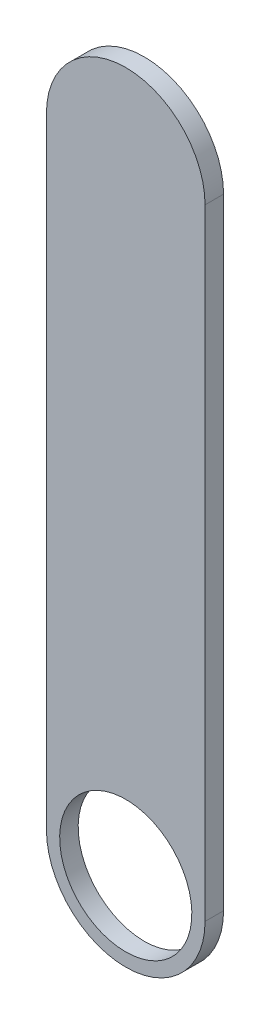
ISO-10303-21;
HEADER;
FILE_DESCRIPTION(('STEP AP214'),'2;1');
FILE_NAME('part.step','',(''),(''),'','','');
FILE_SCHEMA(('AUTOMOTIVE_DESIGN { 1 0 10303 214 1 1 1 1 }'));
ENDSEC;
DATA;
#1=APPLICATION_CONTEXT('core data for automotive mechanical design processes');
#2=APPLICATION_PROTOCOL_DEFINITION('international standard','automotive_design',2000,#1);
#3=PRODUCT_CONTEXT('',#1,'mechanical');
#4=PRODUCT('Part','Part','',(#3));
#5=PRODUCT_RELATED_PRODUCT_CATEGORY('part','',(#4));
#6=PRODUCT_DEFINITION_FORMATION('','',#4);
#7=PRODUCT_DEFINITION_CONTEXT('part definition',#1,'design');
#8=PRODUCT_DEFINITION('design','',#6,#7);
#9=PRODUCT_DEFINITION_SHAPE('','',#8);
#10=(LENGTH_UNIT() NAMED_UNIT(*) SI_UNIT(.MILLI.,.METRE.));
#11=(NAMED_UNIT(*) PLANE_ANGLE_UNIT() SI_UNIT($,.RADIAN.));
#12=(NAMED_UNIT(*) SI_UNIT($,.STERADIAN.) SOLID_ANGLE_UNIT());
#13=UNCERTAINTY_MEASURE_WITH_UNIT(LENGTH_MEASURE(1.E-05),#10,'distance_accuracy_value','');
#14=(GEOMETRIC_REPRESENTATION_CONTEXT(3) GLOBAL_UNCERTAINTY_ASSIGNED_CONTEXT((#13)) GLOBAL_UNIT_ASSIGNED_CONTEXT((#10,
#11,#12)) REPRESENTATION_CONTEXT('',''));
#15=CARTESIAN_POINT('',(0.,0.,0.));
#16=DIRECTION('',(0.,0.,1.));
#17=DIRECTION('',(1.,0.,0.));
#18=AXIS2_PLACEMENT_3D('',#15,#16,#17);
#19=CARTESIAN_POINT('',(89.575,-131.37,-0.045));
#20=DIRECTION('',(0.,0.,-1.));
#21=DIRECTION('',(0.,-1.,0.));
#22=AXIS2_PLACEMENT_3D('',#19,#20,#21);
#23=CYLINDRICAL_SURFACE('',#22,0.125);
#24=CARTESIAN_POINT('',(89.575,-131.37,1.6));
#25=DIRECTION('',(0.,0.,-1.));
#26=DIRECTION('',(0.,-1.,0.));
#27=AXIS2_PLACEMENT_3D('',#24,#25,#26);
#28=CIRCLE('',#27,0.125);
#29=CARTESIAN_POINT('',(89.575,-131.495,1.6));
#30=VERTEX_POINT('',#29);
#31=EDGE_CURVE('E74',#30,#30,#28,.T.);
#32=ORIENTED_EDGE('',*,*,#31,.T.);
#33=DIRECTION('',(0.,0.,1.));
#34=VECTOR('',#33,1.);
#35=CARTESIAN_POINT('',(89.575,-131.495,-0.045));
#36=LINE('',#35,#34);
#37=CARTESIAN_POINT('',(89.575,-131.495,1.635));
#38=VERTEX_POINT('',#37);
#39=EDGE_CURVE('E11',#30,#38,#36,.T.);
#40=ORIENTED_EDGE('',*,*,#39,.T.);
#41=CARTESIAN_POINT('',(89.575,-131.37,1.635));
#42=DIRECTION('',(0.,0.,-1.));
#43=DIRECTION('',(0.,-1.,0.));
#44=AXIS2_PLACEMENT_3D('',#41,#42,#43);
#45=CIRCLE('',#44,0.125);
#46=EDGE_CURVE('E26',#38,#38,#45,.T.);
#47=ORIENTED_EDGE('',*,*,#46,.F.);
#48=ORIENTED_EDGE('',*,*,#39,.F.);
#49=EDGE_LOOP('',(#32,#40,#47,#48));
#50=FACE_BOUND('',#49,.T.);
#51=ADVANCED_FACE('F17',(#50),#23,.F.);
#52=CARTESIAN_POINT('',(89.425,-130.196178,1.6));
#53=DIRECTION('',(1.,0.,0.));
#54=DIRECTION('',(0.,1.,0.));
#55=AXIS2_PLACEMENT_3D('',#52,#53,#54);
#56=PLANE('',#55);
#57=DIRECTION('',(0.,-1.,0.));
#58=VECTOR('',#57,1.);
#59=CARTESIAN_POINT('',(89.425,-130.196178,1.6));
#60=LINE('',#59,#58);
#61=CARTESIAN_POINT('',(89.425,-130.196178,1.6));
#62=VERTEX_POINT('',#61);
#63=CARTESIAN_POINT('',(89.425,-131.37,1.6));
#64=VERTEX_POINT('',#63);
#65=EDGE_CURVE('E60',#62,#64,#60,.T.);
#66=ORIENTED_EDGE('',*,*,#65,.T.);
#67=DIRECTION('',(0.,0.,1.));
#68=VECTOR('',#67,1.);
#69=CARTESIAN_POINT('',(89.425,-131.37,1.6));
#70=LINE('',#69,#68);
#71=CARTESIAN_POINT('',(89.425,-131.37,1.635));
#72=VERTEX_POINT('',#71);
#73=EDGE_CURVE('E91',#64,#72,#70,.T.);
#74=ORIENTED_EDGE('',*,*,#73,.T.);
#75=DIRECTION('',(0.,-1.,0.));
#76=VECTOR('',#75,1.);
#77=CARTESIAN_POINT('',(89.425,-130.196178,1.635));
#78=LINE('',#77,#76);
#79=CARTESIAN_POINT('',(89.425,-130.196178,1.635));
#80=VERTEX_POINT('',#79);
#81=EDGE_CURVE('E80',#80,#72,#78,.T.);
#82=ORIENTED_EDGE('',*,*,#81,.F.);
#83=DIRECTION('',(0.,0.,1.));
#84=VECTOR('',#83,1.);
#85=CARTESIAN_POINT('',(89.425,-130.196178,1.6));
#86=LINE('',#85,#84);
#87=EDGE_CURVE('E78',#62,#80,#86,.T.);
#88=ORIENTED_EDGE('',*,*,#87,.F.);
#89=EDGE_LOOP('',(#66,#74,#82,#88));
#90=FACE_BOUND('',#89,.T.);
#91=ADVANCED_FACE('F79',(#90),#56,.F.);
#92=CARTESIAN_POINT('',(89.725,-131.37,1.635));
#93=DIRECTION('',(0.,0.,1.));
#94=DIRECTION('',(1.,0.,0.));
#95=AXIS2_PLACEMENT_3D('',#92,#93,#94);
#96=PLANE('',#95);
#97=ORIENTED_EDGE('',*,*,#46,.T.);
#98=EDGE_LOOP('',(#97));
#99=FACE_BOUND('',#98,.T.);
#100=DIRECTION('',(0.,1.,0.));
#101=VECTOR('',#100,1.);
#102=CARTESIAN_POINT('',(89.725,-131.37,1.635));
#103=LINE('',#102,#101);
#104=CARTESIAN_POINT('',(89.725,-131.37,1.635));
#105=VERTEX_POINT('',#104);
#106=CARTESIAN_POINT('',(89.725,-130.196178,1.635));
#107=VERTEX_POINT('',#106);
#108=EDGE_CURVE('E120',#105,#107,#103,.T.);
#109=ORIENTED_EDGE('',*,*,#108,.T.);
#110=CARTESIAN_POINT('',(89.575,-130.196178,1.635));
#111=DIRECTION('',(0.,0.,1.));
#112=DIRECTION('',(1.,-1.894780628694E-13,0.));
#113=AXIS2_PLACEMENT_3D('',#110,#111,#112);
#114=CIRCLE('',#113,0.15);
#115=EDGE_CURVE('E75',#107,#80,#114,.T.);
#116=ORIENTED_EDGE('',*,*,#115,.T.);
#117=ORIENTED_EDGE('',*,*,#81,.T.);
#118=CARTESIAN_POINT('',(89.575,-131.37,1.635));
#119=DIRECTION('',(0.,0.,1.));
#120=DIRECTION('',(-1.,0.,0.));
#121=AXIS2_PLACEMENT_3D('',#118,#119,#120);
#122=CIRCLE('',#121,0.15);
#123=EDGE_CURVE('E97',#72,#105,#122,.T.);
#124=ORIENTED_EDGE('',*,*,#123,.T.);
#125=EDGE_LOOP('',(#109,#116,#117,#124));
#126=FACE_BOUND('',#125,.T.);
#127=ADVANCED_FACE('F105',(#99,#126),#96,.T.);
#128=CARTESIAN_POINT('',(89.725,-131.37,1.6));
#129=DIRECTION('',(0.,0.,1.));
#130=DIRECTION('',(1.,0.,0.));
#131=AXIS2_PLACEMENT_3D('',#128,#129,#130);
#132=PLANE('',#131);
#133=ORIENTED_EDGE('',*,*,#31,.F.);
#134=EDGE_LOOP('',(#133));
#135=FACE_BOUND('',#134,.T.);
#136=CARTESIAN_POINT('',(89.575,-131.37,1.6));
#137=DIRECTION('',(0.,0.,1.));
#138=DIRECTION('',(-1.,0.,0.));
#139=AXIS2_PLACEMENT_3D('',#136,#137,#138);
#140=CIRCLE('',#139,0.15);
#141=CARTESIAN_POINT('',(89.725,-131.37,1.6));
#142=VERTEX_POINT('',#141);
#143=EDGE_CURVE('E69',#64,#142,#140,.T.);
#144=ORIENTED_EDGE('',*,*,#143,.F.);
#145=ORIENTED_EDGE('',*,*,#65,.F.);
#146=CARTESIAN_POINT('',(89.575,-130.196178,1.6));
#147=DIRECTION('',(0.,0.,1.));
#148=DIRECTION('',(1.,-1.894780628694E-13,0.));
#149=AXIS2_PLACEMENT_3D('',#146,#147,#148);
#150=CIRCLE('',#149,0.15);
#151=CARTESIAN_POINT('',(89.725,-130.196178,1.6));
#152=VERTEX_POINT('',#151);
#153=EDGE_CURVE('E66',#152,#62,#150,.T.);
#154=ORIENTED_EDGE('',*,*,#153,.F.);
#155=DIRECTION('',(0.,1.,0.));
#156=VECTOR('',#155,1.);
#157=CARTESIAN_POINT('',(89.725,-131.37,1.6));
#158=LINE('',#157,#156);
#159=EDGE_CURVE('E115',#142,#152,#158,.T.);
#160=ORIENTED_EDGE('',*,*,#159,.F.);
#161=EDGE_LOOP('',(#144,#145,#154,#160));
#162=FACE_BOUND('',#161,.T.);
#163=ADVANCED_FACE('F62',(#135,#162),#132,.F.);
#164=CARTESIAN_POINT('',(89.575,-130.196178,1.6));
#165=DIRECTION('',(0.,0.,-1.));
#166=DIRECTION('',(1.,-1.894780628694E-13,0.));
#167=AXIS2_PLACEMENT_3D('',#164,#165,#166);
#168=CYLINDRICAL_SURFACE('',#167,0.15);
#169=ORIENTED_EDGE('',*,*,#153,.T.);
#170=ORIENTED_EDGE('',*,*,#87,.T.);
#171=ORIENTED_EDGE('',*,*,#115,.F.);
#172=DIRECTION('',(0.,0.,1.));
#173=VECTOR('',#172,1.);
#174=CARTESIAN_POINT('',(89.725,-130.196178,1.6));
#175=LINE('',#174,#173);
#176=EDGE_CURVE('E88',#152,#107,#175,.T.);
#177=ORIENTED_EDGE('',*,*,#176,.F.);
#178=EDGE_LOOP('',(#169,#170,#171,#177));
#179=FACE_BOUND('',#178,.T.);
#180=ADVANCED_FACE('F86',(#179),#168,.T.);
#181=CARTESIAN_POINT('',(89.575,-131.37,1.6));
#182=DIRECTION('',(0.,0.,-1.));
#183=DIRECTION('',(-1.,0.,0.));
#184=AXIS2_PLACEMENT_3D('',#181,#182,#183);
#185=CYLINDRICAL_SURFACE('',#184,0.15);
#186=ORIENTED_EDGE('',*,*,#143,.T.);
#187=DIRECTION('',(0.,0.,1.));
#188=VECTOR('',#187,1.);
#189=CARTESIAN_POINT('',(89.725,-131.37,1.6));
#190=LINE('',#189,#188);
#191=EDGE_CURVE('E116',#142,#105,#190,.T.);
#192=ORIENTED_EDGE('',*,*,#191,.T.);
#193=ORIENTED_EDGE('',*,*,#123,.F.);
#194=ORIENTED_EDGE('',*,*,#73,.F.);
#195=EDGE_LOOP('',(#186,#192,#193,#194));
#196=FACE_BOUND('',#195,.T.);
#197=ADVANCED_FACE('F139',(#196),#185,.T.);
#198=CARTESIAN_POINT('',(89.725,-131.37,1.6));
#199=DIRECTION('',(-1.,0.,0.));
#200=DIRECTION('',(0.,0.,1.));
#201=AXIS2_PLACEMENT_3D('',#198,#199,#200);
#202=PLANE('',#201);
#203=ORIENTED_EDGE('',*,*,#159,.T.);
#204=ORIENTED_EDGE('',*,*,#176,.T.);
#205=ORIENTED_EDGE('',*,*,#108,.F.);
#206=ORIENTED_EDGE('',*,*,#191,.F.);
#207=EDGE_LOOP('',(#203,#204,#205,#206));
#208=FACE_BOUND('',#207,.T.);
#209=ADVANCED_FACE('F142',(#208),#202,.F.);
#210=CLOSED_SHELL('',(#51,#91,#127,#163,#180,#197,#209));
#211=MANIFOLD_SOLID_BREP('B1',#210);
#212=ADVANCED_BREP_SHAPE_REPRESENTATION('',(#18,#211),#14);
#213=SHAPE_DEFINITION_REPRESENTATION(#9,#212);
ENDSEC;
END-ISO-10303-21;
